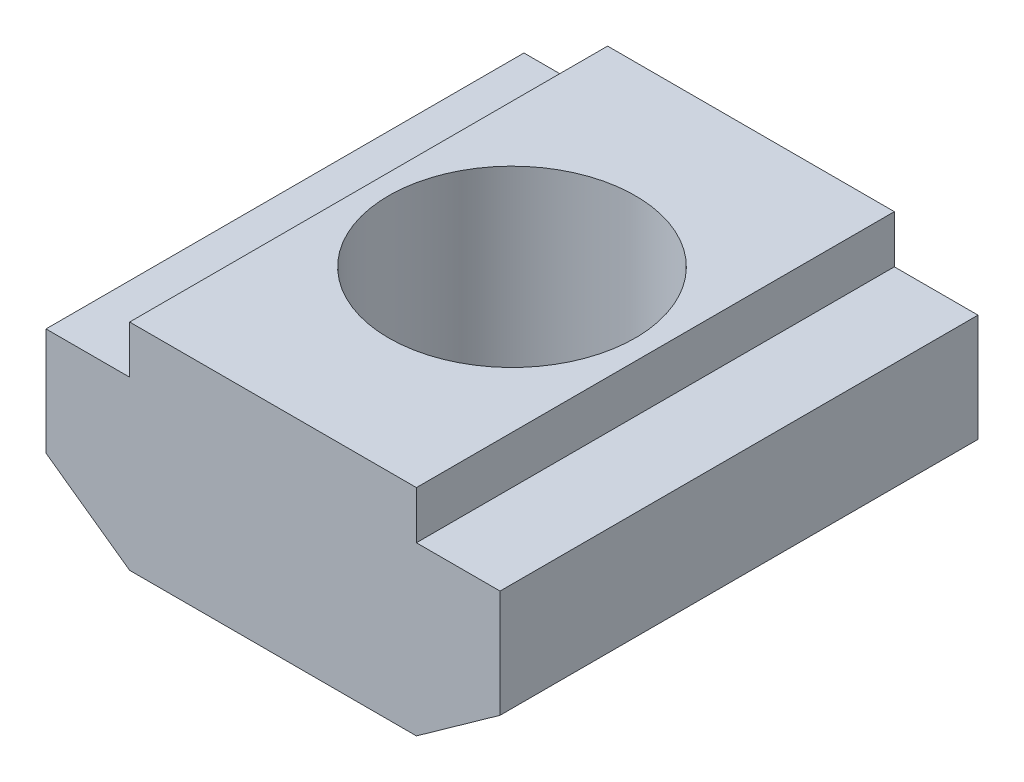
ISO-10303-21;
HEADER;
FILE_DESCRIPTION(('STEP AP214'),'2;1');
FILE_NAME('part.step','',(''),(''),'','','');
FILE_SCHEMA(('AUTOMOTIVE_DESIGN { 1 0 10303 214 1 1 1 1 }'));
ENDSEC;
DATA;
#1=APPLICATION_CONTEXT('core data for automotive mechanical design processes');
#2=APPLICATION_PROTOCOL_DEFINITION('international standard','automotive_design',2000,#1);
#3=PRODUCT_CONTEXT('',#1,'mechanical');
#4=PRODUCT('Part','Part','',(#3));
#5=PRODUCT_RELATED_PRODUCT_CATEGORY('part','',(#4));
#6=PRODUCT_DEFINITION_FORMATION('','',#4);
#7=PRODUCT_DEFINITION_CONTEXT('part definition',#1,'design');
#8=PRODUCT_DEFINITION('design','',#6,#7);
#9=PRODUCT_DEFINITION_SHAPE('','',#8);
#10=(LENGTH_UNIT() NAMED_UNIT(*) SI_UNIT(.MILLI.,.METRE.));
#11=(NAMED_UNIT(*) PLANE_ANGLE_UNIT() SI_UNIT($,.RADIAN.));
#12=(NAMED_UNIT(*) SI_UNIT($,.STERADIAN.) SOLID_ANGLE_UNIT());
#13=UNCERTAINTY_MEASURE_WITH_UNIT(LENGTH_MEASURE(1.E-05),#10,'distance_accuracy_value','');
#14=(GEOMETRIC_REPRESENTATION_CONTEXT(3) GLOBAL_UNCERTAINTY_ASSIGNED_CONTEXT((#13)) GLOBAL_UNIT_ASSIGNED_CONTEXT((#10,
#11,#12)) REPRESENTATION_CONTEXT('',''));
#15=CARTESIAN_POINT('',(0.,0.,0.));
#16=DIRECTION('',(0.,0.,1.));
#17=DIRECTION('',(1.,0.,0.));
#18=AXIS2_PLACEMENT_3D('',#15,#16,#17);
#19=CARTESIAN_POINT('',(2.99999999999989,1.11022302462516E-12,10.0000000000002));
#20=DIRECTION('',(-1.00000000000001,0.,0.));
#21=DIRECTION('',(0.,-0.999999999999998,0.));
#22=AXIS2_PLACEMENT_3D('',#19,#20,#21);
#23=PLANE('',#22);
#24=DIRECTION('',(0.,0.999999999999998,0.));
#25=VECTOR('',#24,1.);
#26=CARTESIAN_POINT('',(3.00000000000011,2.22044604925031E-13,6.66133814775094E-13));
#27=LINE('',#26,#25);
#28=CARTESIAN_POINT('',(3.00000000000011,-0.99999999999989,6.66133814775094E-13));
#29=VERTEX_POINT('',#28);
#30=CARTESIAN_POINT('',(3.00000000000011,2.22044604925031E-13,6.66133814775094E-13));
#31=VERTEX_POINT('',#30);
#32=EDGE_CURVE('E166',#29,#31,#27,.T.);
#33=ORIENTED_EDGE('',*,*,#32,.T.);
#34=DIRECTION('',(0.,0.,-0.999999999999998));
#35=VECTOR('',#34,1.);
#36=CARTESIAN_POINT('',(2.99999999999989,1.11022302462516E-12,10.0000000000002));
#37=LINE('',#36,#35);
#38=CARTESIAN_POINT('',(2.99999999999989,1.11022302462516E-12,10.0000000000002));
#39=VERTEX_POINT('',#38);
#40=EDGE_CURVE('E11',#39,#31,#37,.T.);
#41=ORIENTED_EDGE('',*,*,#40,.F.);
#42=DIRECTION('',(0.,0.999999999999998,0.));
#43=VECTOR('',#42,1.);
#44=CARTESIAN_POINT('',(2.99999999999989,1.11022302462516E-12,10.0000000000002));
#45=LINE('',#44,#43);
#46=CARTESIAN_POINT('',(3.00000000000034,-0.999999999999002,10.0000000000002));
#47=VERTEX_POINT('',#46);
#48=EDGE_CURVE('E195',#47,#39,#45,.T.);
#49=ORIENTED_EDGE('',*,*,#48,.F.);
#50=DIRECTION('',(0.,0.,-0.999999999999998));
#51=VECTOR('',#50,1.);
#52=CARTESIAN_POINT('',(3.00000000000034,-0.999999999999002,10.0000000000002));
#53=LINE('',#52,#51);
#54=EDGE_CURVE('E162',#47,#29,#53,.T.);
#55=ORIENTED_EDGE('',*,*,#54,.T.);
#56=EDGE_LOOP('',(#33,#41,#49,#55));
#57=FACE_BOUND('',#56,.T.);
#58=ADVANCED_FACE('F51',(#57),#23,.F.);
#59=CARTESIAN_POINT('',(-2.99999999999967,4.44089209850063E-13,9.99999999999956));
#60=DIRECTION('',(0.,-0.999999999999998,0.));
#61=DIRECTION('',(0.,0.,-0.999999999999998));
#62=AXIS2_PLACEMENT_3D('',#59,#60,#61);
#63=PLANE('',#62);
#64=CARTESIAN_POINT('',(0.,8.88178419700125E-13,5.00000000000012));
#65=DIRECTION('',(0.,0.999999999999998,0.));
#66=DIRECTION('',(0.,0.,0.999999999999998));
#67=AXIS2_PLACEMENT_3D('',#64,#65,#66);
#68=CIRCLE('',#67,2.58);
#69=CARTESIAN_POINT('',(1.11029371715187E-12,8.89045781438114E-13,7.58000000000011));
#70=VERTEX_POINT('',#69);
#71=EDGE_CURVE('E276',#70,#70,#68,.T.);
#72=ORIENTED_EDGE('',*,*,#71,.F.);
#73=EDGE_LOOP('',(#72));
#74=FACE_BOUND('',#73,.T.);
#75=DIRECTION('',(-1.00000000000001,0.,0.));
#76=VECTOR('',#75,1.);
#77=CARTESIAN_POINT('',(-3.00000000000011,-4.44089209850063E-13,-2.22044604925031E-13));
#78=LINE('',#77,#76);
#79=CARTESIAN_POINT('',(-3.00000000000011,-4.44089209850063E-13,-2.22044604925031E-13));
#80=VERTEX_POINT('',#79);
#81=EDGE_CURVE('E170',#31,#80,#78,.T.);
#82=ORIENTED_EDGE('',*,*,#81,.T.);
#83=DIRECTION('',(0.,0.,-0.999999999999998));
#84=VECTOR('',#83,1.);
#85=CARTESIAN_POINT('',(-2.99999999999967,4.44089209850063E-13,9.99999999999956));
#86=LINE('',#85,#84);
#87=CARTESIAN_POINT('',(-2.99999999999967,4.44089209850063E-13,9.99999999999956));
#88=VERTEX_POINT('',#87);
#89=EDGE_CURVE('E60',#88,#80,#86,.T.);
#90=ORIENTED_EDGE('',*,*,#89,.F.);
#91=DIRECTION('',(-1.00000000000001,0.,0.));
#92=VECTOR('',#91,1.);
#93=CARTESIAN_POINT('',(-2.99999999999967,4.44089209850063E-13,9.99999999999956));
#94=LINE('',#93,#92);
#95=EDGE_CURVE('E117',#39,#88,#94,.T.);
#96=ORIENTED_EDGE('',*,*,#95,.F.);
#97=ORIENTED_EDGE('',*,*,#40,.T.);
#98=EDGE_LOOP('',(#82,#90,#96,#97));
#99=FACE_BOUND('',#98,.T.);
#100=ADVANCED_FACE('F328',(#74,#99),#63,.F.);
#101=CARTESIAN_POINT('',(-2.99999999999967,4.44089209850063E-13,9.99999999999956));
#102=DIRECTION('',(1.00000000000001,0.,0.));
#103=DIRECTION('',(0.,0.999999999999998,0.));
#104=AXIS2_PLACEMENT_3D('',#101,#102,#103);
#105=PLANE('',#104);
#106=DIRECTION('',(0.,-0.999999999999998,0.));
#107=VECTOR('',#106,1.);
#108=CARTESIAN_POINT('',(-3.00000000000011,-4.44089209850063E-13,-2.22044604925031E-13));
#109=LINE('',#108,#107);
#110=CARTESIAN_POINT('',(-3.00000000000011,-1.00000000000033,-2.22044604925031E-13));
#111=VERTEX_POINT('',#110);
#112=EDGE_CURVE('E174',#80,#111,#109,.T.);
#113=ORIENTED_EDGE('',*,*,#112,.T.);
#114=DIRECTION('',(0.,0.,-0.999999999999998));
#115=VECTOR('',#114,1.);
#116=CARTESIAN_POINT('',(-2.99999999999967,-0.999999999999446,9.99999999999956));
#117=LINE('',#116,#115);
#118=CARTESIAN_POINT('',(-2.99999999999967,-0.999999999999446,9.99999999999956));
#119=VERTEX_POINT('',#118);
#120=EDGE_CURVE('E214',#119,#111,#117,.T.);
#121=ORIENTED_EDGE('',*,*,#120,.F.);
#122=DIRECTION('',(0.,-0.999999999999998,0.));
#123=VECTOR('',#122,1.);
#124=CARTESIAN_POINT('',(-2.99999999999967,4.44089209850063E-13,9.99999999999956));
#125=LINE('',#124,#123);
#126=EDGE_CURVE('E226',#88,#119,#125,.T.);
#127=ORIENTED_EDGE('',*,*,#126,.F.);
#128=ORIENTED_EDGE('',*,*,#89,.T.);
#129=EDGE_LOOP('',(#113,#121,#127,#128));
#130=FACE_BOUND('',#129,.T.);
#131=ADVANCED_FACE('F224',(#130),#105,.F.);
#132=CARTESIAN_POINT('',(-2.99999999999967,-0.999999999999446,9.99999999999956));
#133=DIRECTION('',(0.,-0.999999999999998,0.));
#134=DIRECTION('',(0.,0.,-0.999999999999998));
#135=AXIS2_PLACEMENT_3D('',#132,#133,#134);
#136=PLANE('',#135);
#137=DIRECTION('',(-1.00000000000001,0.,0.));
#138=VECTOR('',#137,1.);
#139=CARTESIAN_POINT('',(-3.00000000000011,-1.00000000000033,-2.22044604925031E-13));
#140=LINE('',#139,#138);
#141=CARTESIAN_POINT('',(-4.75000000000048,-1.00000000000033,0.));
#142=VERTEX_POINT('',#141);
#143=EDGE_CURVE('E177',#111,#142,#140,.T.);
#144=ORIENTED_EDGE('',*,*,#143,.T.);
#145=DIRECTION('',(0.,0.,-0.999999999999998));
#146=VECTOR('',#145,1.);
#147=CARTESIAN_POINT('',(-4.75000000000003,-0.999999999999446,10.));
#148=LINE('',#147,#146);
#149=CARTESIAN_POINT('',(-4.75000000000003,-0.999999999999446,10.));
#150=VERTEX_POINT('',#149);
#151=EDGE_CURVE('E210',#150,#142,#148,.T.);
#152=ORIENTED_EDGE('',*,*,#151,.F.);
#153=DIRECTION('',(-1.00000000000001,0.,0.));
#154=VECTOR('',#153,1.);
#155=CARTESIAN_POINT('',(-2.99999999999967,-0.999999999999446,9.99999999999956));
#156=LINE('',#155,#154);
#157=EDGE_CURVE('E245',#119,#150,#156,.T.);
#158=ORIENTED_EDGE('',*,*,#157,.F.);
#159=ORIENTED_EDGE('',*,*,#120,.T.);
#160=EDGE_LOOP('',(#144,#152,#158,#159));
#161=FACE_BOUND('',#160,.T.);
#162=ADVANCED_FACE('F235',(#161),#136,.F.);
#163=CARTESIAN_POINT('',(-4.75000000000003,-0.999999999999446,10.));
#164=DIRECTION('',(1.00000000000001,0.,0.));
#165=DIRECTION('',(0.,0.,-0.999999999999998));
#166=AXIS2_PLACEMENT_3D('',#163,#164,#165);
#167=PLANE('',#166);
#168=DIRECTION('',(0.,-0.999999999999998,0.));
#169=VECTOR('',#168,1.);
#170=CARTESIAN_POINT('',(-4.75000000000048,-1.00000000000033,0.));
#171=LINE('',#170,#169);
#172=CARTESIAN_POINT('',(-4.75000000000048,-3.25173713118065,0.));
#173=VERTEX_POINT('',#172);
#174=EDGE_CURVE('E180',#142,#173,#171,.T.);
#175=ORIENTED_EDGE('',*,*,#174,.T.);
#176=DIRECTION('',(0.,0.,-0.999999999999998));
#177=VECTOR('',#176,1.);
#178=CARTESIAN_POINT('',(-4.74999999999959,-3.25173713117977,10.));
#179=LINE('',#178,#177);
#180=CARTESIAN_POINT('',(-4.74999999999959,-3.25173713117977,10.));
#181=VERTEX_POINT('',#180);
#182=EDGE_CURVE('E206',#181,#173,#179,.T.);
#183=ORIENTED_EDGE('',*,*,#182,.F.);
#184=DIRECTION('',(0.,-0.999999999999998,0.));
#185=VECTOR('',#184,1.);
#186=CARTESIAN_POINT('',(-4.75000000000003,-0.999999999999446,10.));
#187=LINE('',#186,#185);
#188=EDGE_CURVE('E241',#150,#181,#187,.T.);
#189=ORIENTED_EDGE('',*,*,#188,.F.);
#190=ORIENTED_EDGE('',*,*,#151,.T.);
#191=EDGE_LOOP('',(#175,#183,#189,#190));
#192=FACE_BOUND('',#191,.T.);
#193=ADVANCED_FACE('F239',(#192),#167,.F.);
#194=CARTESIAN_POINT('',(-4.74999999999959,-3.25173713117977,10.));
#195=DIRECTION('',(0.580702955710946,0.814115518356316,0.));
#196=DIRECTION('',(-0.814115518356326,0.580702955710939,0.));
#197=AXIS2_PLACEMENT_3D('',#194,#195,#196);
#198=PLANE('',#197);
#199=DIRECTION('',(0.814115518356326,-0.580702955710939,0.));
#200=VECTOR('',#199,1.);
#201=CARTESIAN_POINT('',(-4.75000000000048,-3.25173713118065,0.));
#202=LINE('',#201,#200);
#203=CARTESIAN_POINT('',(-2.99999999999967,-4.50000000000039,-2.22044604925031E-13));
#204=VERTEX_POINT('',#203);
#205=EDGE_CURVE('E183',#173,#204,#202,.T.);
#206=ORIENTED_EDGE('',*,*,#205,.T.);
#207=DIRECTION('',(0.,0.,-0.999999999999998));
#208=VECTOR('',#207,1.);
#209=CARTESIAN_POINT('',(-3.00000000000078,-4.4999999999995,9.99999999999956));
#210=LINE('',#209,#208);
#211=CARTESIAN_POINT('',(-3.00000000000078,-4.4999999999995,9.99999999999956));
#212=VERTEX_POINT('',#211);
#213=EDGE_CURVE('E202',#212,#204,#210,.T.);
#214=ORIENTED_EDGE('',*,*,#213,.F.);
#215=DIRECTION('',(0.814115518356326,-0.580702955710939,0.));
#216=VECTOR('',#215,1.);
#217=CARTESIAN_POINT('',(-4.74999999999959,-3.25173713117977,10.));
#218=LINE('',#217,#216);
#219=EDGE_CURVE('E244',#181,#212,#218,.T.);
#220=ORIENTED_EDGE('',*,*,#219,.F.);
#221=ORIENTED_EDGE('',*,*,#182,.T.);
#222=EDGE_LOOP('',(#206,#214,#220,#221));
#223=FACE_BOUND('',#222,.T.);
#224=ADVANCED_FACE('F342',(#223),#198,.F.);
#225=CARTESIAN_POINT('',(3.00000000000034,-4.49999999999906,10.0000000000002));
#226=DIRECTION('',(0.,0.999999999999998,0.));
#227=DIRECTION('',(0.,0.,0.999999999999998));
#228=AXIS2_PLACEMENT_3D('',#225,#226,#227);
#229=PLANE('',#228);
#230=CARTESIAN_POINT('',(1.11022302462516E-12,-4.49999999999906,5.00000000000012));
#231=DIRECTION('',(0.,0.999999999999998,0.));
#232=DIRECTION('',(0.,0.,0.999999999999998));
#233=AXIS2_PLACEMENT_3D('',#230,#231,#232);
#234=CIRCLE('',#233,2.58);
#235=CARTESIAN_POINT('',(1.1102480879083E-12,-4.49999999999906,7.58000000000011));
#236=VERTEX_POINT('',#235);
#237=EDGE_CURVE('E171',#236,#236,#234,.F.);
#238=ORIENTED_EDGE('',*,*,#237,.F.);
#239=EDGE_LOOP('',(#238));
#240=FACE_BOUND('',#239,.T.);
#241=DIRECTION('',(1.00000000000001,0.,0.));
#242=VECTOR('',#241,1.);
#243=CARTESIAN_POINT('',(3.00000000000034,-4.49999999999995,6.66133814775094E-13));
#244=LINE('',#243,#242);
#245=CARTESIAN_POINT('',(3.00000000000034,-4.49999999999995,6.66133814775094E-13));
#246=VERTEX_POINT('',#245);
#247=EDGE_CURVE('E186',#204,#246,#244,.T.);
#248=ORIENTED_EDGE('',*,*,#247,.T.);
#249=DIRECTION('',(0.,0.,-0.999999999999998));
#250=VECTOR('',#249,1.);
#251=CARTESIAN_POINT('',(3.00000000000034,-4.49999999999906,10.0000000000002));
#252=LINE('',#251,#250);
#253=CARTESIAN_POINT('',(3.00000000000034,-4.49999999999906,10.0000000000002));
#254=VERTEX_POINT('',#253);
#255=EDGE_CURVE('E153',#254,#246,#252,.T.);
#256=ORIENTED_EDGE('',*,*,#255,.F.);
#257=DIRECTION('',(1.00000000000001,0.,0.));
#258=VECTOR('',#257,1.);
#259=CARTESIAN_POINT('',(3.00000000000034,-4.49999999999906,10.0000000000002));
#260=LINE('',#259,#258);
#261=EDGE_CURVE('E142',#212,#254,#260,.T.);
#262=ORIENTED_EDGE('',*,*,#261,.F.);
#263=ORIENTED_EDGE('',*,*,#213,.T.);
#264=EDGE_LOOP('',(#248,#256,#262,#263));
#265=FACE_BOUND('',#264,.T.);
#266=ADVANCED_FACE('F345',(#240,#265),#229,.F.);
#267=CARTESIAN_POINT('',(4.74999999999914,-3.2517371311791,10.0000000000009));
#268=DIRECTION('',(-0.580702955710947,0.814115518356316,0.));
#269=DIRECTION('',(-0.814115518356327,-0.580702955710939,0.));
#270=AXIS2_PLACEMENT_3D('',#267,#268,#269);
#271=PLANE('',#270);
#272=DIRECTION('',(0.814115518356327,0.580702955710939,0.));
#273=VECTOR('',#272,1.);
#274=CARTESIAN_POINT('',(4.74999999999914,-3.25173713117999,4.44089209850063E-13));
#275=LINE('',#274,#273);
#276=CARTESIAN_POINT('',(4.74999999999914,-3.25173713117999,4.44089209850063E-13));
#277=VERTEX_POINT('',#276);
#278=EDGE_CURVE('E151',#246,#277,#275,.T.);
#279=ORIENTED_EDGE('',*,*,#278,.T.);
#280=DIRECTION('',(0.,0.,-0.999999999999998));
#281=VECTOR('',#280,1.);
#282=CARTESIAN_POINT('',(4.74999999999914,-3.2517371311791,10.0000000000009));
#283=LINE('',#282,#281);
#284=CARTESIAN_POINT('',(4.74999999999914,-3.2517371311791,10.0000000000009));
#285=VERTEX_POINT('',#284);
#286=EDGE_CURVE('E148',#285,#277,#283,.T.);
#287=ORIENTED_EDGE('',*,*,#286,.F.);
#288=DIRECTION('',(0.814115518356327,0.580702955710939,0.));
#289=VECTOR('',#288,1.);
#290=CARTESIAN_POINT('',(4.74999999999914,-3.2517371311791,10.0000000000009));
#291=LINE('',#290,#289);
#292=EDGE_CURVE('E136',#254,#285,#291,.T.);
#293=ORIENTED_EDGE('',*,*,#292,.F.);
#294=ORIENTED_EDGE('',*,*,#255,.T.);
#295=EDGE_LOOP('',(#279,#287,#293,#294));
#296=FACE_BOUND('',#295,.T.);
#297=ADVANCED_FACE('F149',(#296),#271,.F.);
#298=CARTESIAN_POINT('',(4.74999999999914,-0.99999999999878,10.0000000000009));
#299=DIRECTION('',(-1.00000000000001,0.,0.));
#300=DIRECTION('',(0.,0.,0.999999999999998));
#301=AXIS2_PLACEMENT_3D('',#298,#299,#300);
#302=PLANE('',#301);
#303=DIRECTION('',(0.,0.999999999999998,0.));
#304=VECTOR('',#303,1.);
#305=CARTESIAN_POINT('',(4.75000000000025,-0.999999999999668,4.44089209850063E-13));
#306=LINE('',#305,#304);
#307=CARTESIAN_POINT('',(4.75000000000025,-0.999999999999668,4.44089209850063E-13));
#308=VERTEX_POINT('',#307);
#309=EDGE_CURVE('E103',#277,#308,#306,.T.);
#310=ORIENTED_EDGE('',*,*,#309,.T.);
#311=DIRECTION('',(0.,0.,-0.999999999999998));
#312=VECTOR('',#311,1.);
#313=CARTESIAN_POINT('',(4.74999999999914,-0.99999999999878,10.0000000000009));
#314=LINE('',#313,#312);
#315=CARTESIAN_POINT('',(4.74999999999914,-0.99999999999878,10.0000000000009));
#316=VERTEX_POINT('',#315);
#317=EDGE_CURVE('E154',#316,#308,#314,.T.);
#318=ORIENTED_EDGE('',*,*,#317,.F.);
#319=DIRECTION('',(0.,0.999999999999998,0.));
#320=VECTOR('',#319,1.);
#321=CARTESIAN_POINT('',(4.74999999999914,-0.99999999999878,10.0000000000009));
#322=LINE('',#321,#320);
#323=EDGE_CURVE('E140',#285,#316,#322,.T.);
#324=ORIENTED_EDGE('',*,*,#323,.F.);
#325=ORIENTED_EDGE('',*,*,#286,.T.);
#326=EDGE_LOOP('',(#310,#318,#324,#325));
#327=FACE_BOUND('',#326,.T.);
#328=ADVANCED_FACE('F156',(#327),#302,.F.);
#329=CARTESIAN_POINT('',(3.00000000000034,-0.999999999999002,10.0000000000002));
#330=DIRECTION('',(0.,-0.999999999999998,0.));
#331=DIRECTION('',(0.,0.,-0.999999999999998));
#332=AXIS2_PLACEMENT_3D('',#329,#330,#331);
#333=PLANE('',#332);
#334=DIRECTION('',(-1.00000000000001,0.,0.));
#335=VECTOR('',#334,1.);
#336=CARTESIAN_POINT('',(3.00000000000011,-0.99999999999989,6.66133814775094E-13));
#337=LINE('',#336,#335);
#338=EDGE_CURVE('E109',#308,#29,#337,.T.);
#339=ORIENTED_EDGE('',*,*,#338,.T.);
#340=ORIENTED_EDGE('',*,*,#54,.F.);
#341=DIRECTION('',(-1.00000000000001,0.,0.));
#342=VECTOR('',#341,1.);
#343=CARTESIAN_POINT('',(3.00000000000034,-0.999999999999002,10.0000000000002));
#344=LINE('',#343,#342);
#345=EDGE_CURVE('E68',#316,#47,#344,.T.);
#346=ORIENTED_EDGE('',*,*,#345,.F.);
#347=ORIENTED_EDGE('',*,*,#317,.T.);
#348=EDGE_LOOP('',(#339,#340,#346,#347));
#349=FACE_BOUND('',#348,.T.);
#350=ADVANCED_FACE('F354',(#349),#333,.F.);
#351=CARTESIAN_POINT('',(0.,8.88178419700125E-13,9.99999999999956));
#352=DIRECTION('',(0.,0.,0.999999999999998));
#353=DIRECTION('',(1.00000000000001,0.,0.));
#354=AXIS2_PLACEMENT_3D('',#351,#352,#353);
#355=PLANE('',#354);
#356=ORIENTED_EDGE('',*,*,#48,.T.);
#357=ORIENTED_EDGE('',*,*,#95,.T.);
#358=ORIENTED_EDGE('',*,*,#126,.T.);
#359=ORIENTED_EDGE('',*,*,#157,.T.);
#360=ORIENTED_EDGE('',*,*,#188,.T.);
#361=ORIENTED_EDGE('',*,*,#219,.T.);
#362=ORIENTED_EDGE('',*,*,#261,.T.);
#363=ORIENTED_EDGE('',*,*,#292,.T.);
#364=ORIENTED_EDGE('',*,*,#323,.T.);
#365=ORIENTED_EDGE('',*,*,#345,.T.);
#366=EDGE_LOOP('',(#356,#357,#358,#359,#360,#361,#362,#363,#364,#365));
#367=FACE_BOUND('',#366,.T.);
#368=ADVANCED_FACE('F138',(#367),#355,.T.);
#369=CARTESIAN_POINT('',(0.,0.,0.));
#370=DIRECTION('',(0.,0.,0.999999999999998));
#371=DIRECTION('',(1.00000000000001,0.,0.));
#372=AXIS2_PLACEMENT_3D('',#369,#370,#371);
#373=PLANE('',#372);
#374=ORIENTED_EDGE('',*,*,#32,.F.);
#375=ORIENTED_EDGE('',*,*,#338,.F.);
#376=ORIENTED_EDGE('',*,*,#309,.F.);
#377=ORIENTED_EDGE('',*,*,#278,.F.);
#378=ORIENTED_EDGE('',*,*,#247,.F.);
#379=ORIENTED_EDGE('',*,*,#205,.F.);
#380=ORIENTED_EDGE('',*,*,#174,.F.);
#381=ORIENTED_EDGE('',*,*,#143,.F.);
#382=ORIENTED_EDGE('',*,*,#112,.F.);
#383=ORIENTED_EDGE('',*,*,#81,.F.);
#384=EDGE_LOOP('',(#374,#375,#376,#377,#378,#379,#380,#381,#382,#383));
#385=FACE_BOUND('',#384,.T.);
#386=ADVANCED_FACE('F230',(#385),#373,.F.);
#387=CARTESIAN_POINT('',(1.11022302462516E-12,-4.50099999999898,5.00000000000012));
#388=DIRECTION('',(0.,0.999999999999998,0.));
#389=DIRECTION('',(0.,0.,0.999999999999998));
#390=AXIS2_PLACEMENT_3D('',#387,#388,#389);
#391=CYLINDRICAL_SURFACE('',#390,2.58);
#392=CARTESIAN_POINT('',(1.11029371715187E-12,8.89045781438114E-13,7.58000000000011));
#393=CARTESIAN_POINT('',(1.11029324184725E-12,-0.0468749999991101,7.58000000000011));
#394=CARTESIAN_POINT('',(1.11029276654263E-12,-0.0937499999991093,7.58000000000011));
#395=CARTESIAN_POINT('',(1.11029181593339E-12,-0.187499999999108,7.58000000000011));
#396=CARTESIAN_POINT('',(1.11029134062877E-12,-0.234374999999108,7.58000000000011));
#397=CARTESIAN_POINT('',(1.11029039001953E-12,-0.328124999999107,7.58000000000011));
#398=CARTESIAN_POINT('',(1.11028991471491E-12,-0.374999999999106,7.58000000000011));
#399=CARTESIAN_POINT('',(1.11028896410567E-12,-0.468749999999105,7.58000000000011));
#400=CARTESIAN_POINT('',(1.11028848880105E-12,-0.515624999999105,7.58000000000011));
#401=CARTESIAN_POINT('',(1.1102875381918E-12,-0.609374999999104,7.58000000000011));
#402=CARTESIAN_POINT('',(1.11028706288718E-12,-0.656249999999103,7.58000000000011));
#403=CARTESIAN_POINT('',(1.11028611227794E-12,-0.749999999999102,7.58000000000011));
#404=CARTESIAN_POINT('',(1.11028563697332E-12,-0.796874999999102,7.58000000000011));
#405=CARTESIAN_POINT('',(1.11028468636408E-12,-0.890624999999101,7.58000000000011));
#406=CARTESIAN_POINT('',(1.11028421105946E-12,-0.9374999999991,7.58000000000011));
#407=CARTESIAN_POINT('',(1.11028326045022E-12,-1.0312499999991,7.58000000000011));
#408=CARTESIAN_POINT('',(1.1102827851456E-12,-1.0781249999991,7.58000000000011));
#409=CARTESIAN_POINT('',(1.11028183453636E-12,-1.1718749999991,7.58000000000011));
#410=CARTESIAN_POINT('',(1.11028135923174E-12,-1.2187499999991,7.58000000000011));
#411=CARTESIAN_POINT('',(1.1102804086225E-12,-1.3124999999991,7.58000000000011));
#412=CARTESIAN_POINT('',(1.11027993331788E-12,-1.35937499999909,7.58000000000011));
#413=CARTESIAN_POINT('',(1.11027898270863E-12,-1.45312499999909,7.58000000000011));
#414=CARTESIAN_POINT('',(1.11027850740401E-12,-1.49999999999909,7.58000000000011));
#415=CARTESIAN_POINT('',(1.11027755679477E-12,-1.59374999999909,7.58000000000011));
#416=CARTESIAN_POINT('',(1.11027708149015E-12,-1.64062499999909,7.58000000000011));
#417=CARTESIAN_POINT('',(1.11027613088091E-12,-1.73437499999909,7.58000000000011));
#418=CARTESIAN_POINT('',(1.11027565557629E-12,-1.78124999999909,7.58000000000011));
#419=CARTESIAN_POINT('',(1.11027470496705E-12,-1.87499999999909,7.58000000000011));
#420=CARTESIAN_POINT('',(1.11027422966243E-12,-1.92187499999909,7.58000000000011));
#421=CARTESIAN_POINT('',(1.11027327905319E-12,-2.01562499999909,7.58000000000011));
#422=CARTESIAN_POINT('',(1.11027280374857E-12,-2.06249999999909,7.58000000000011));
#423=CARTESIAN_POINT('',(1.11027185313933E-12,-2.15624999999909,7.58000000000011));
#424=CARTESIAN_POINT('',(1.11027137783471E-12,-2.20312499999909,7.58000000000011));
#425=CARTESIAN_POINT('',(1.11027042722547E-12,-2.29687499999908,7.58000000000011));
#426=CARTESIAN_POINT('',(1.11026995192084E-12,-2.34374999999908,7.58000000000011));
#427=CARTESIAN_POINT('',(1.1102690013116E-12,-2.43749999999908,7.58000000000011));
#428=CARTESIAN_POINT('',(1.11026852600698E-12,-2.48437499999908,7.58000000000011));
#429=CARTESIAN_POINT('',(1.11026757539774E-12,-2.57812499999908,7.58000000000011));
#430=CARTESIAN_POINT('',(1.11026710009312E-12,-2.62499999999908,7.58000000000011));
#431=CARTESIAN_POINT('',(1.11026614948388E-12,-2.71874999999908,7.58000000000011));
#432=CARTESIAN_POINT('',(1.11026567417926E-12,-2.76562499999908,7.58000000000011));
#433=CARTESIAN_POINT('',(1.11026472357002E-12,-2.85937499999908,7.58000000000011));
#434=CARTESIAN_POINT('',(1.1102642482654E-12,-2.90624999999908,7.58000000000011));
#435=CARTESIAN_POINT('',(1.11026329765616E-12,-2.99999999999908,7.58000000000011));
#436=CARTESIAN_POINT('',(1.11026282235154E-12,-3.04687499999908,7.58000000000011));
#437=CARTESIAN_POINT('',(1.1102618717423E-12,-3.14062499999907,7.58000000000011));
#438=CARTESIAN_POINT('',(1.11026139643768E-12,-3.18749999999907,7.58000000000011));
#439=CARTESIAN_POINT('',(1.11026044582843E-12,-3.28124999999907,7.58000000000011));
#440=CARTESIAN_POINT('',(1.11025997052381E-12,-3.32812499999907,7.58000000000011));
#441=CARTESIAN_POINT('',(1.11025901991457E-12,-3.42187499999907,7.58000000000011));
#442=CARTESIAN_POINT('',(1.11025854460995E-12,-3.46874999999907,7.58000000000011));
#443=CARTESIAN_POINT('',(1.11025759400071E-12,-3.56249999999907,7.58000000000011));
#444=CARTESIAN_POINT('',(1.11025711869609E-12,-3.60937499999907,7.58000000000011));
#445=CARTESIAN_POINT('',(1.11025616808685E-12,-3.70312499999907,7.58000000000011));
#446=CARTESIAN_POINT('',(1.11025569278223E-12,-3.74999999999907,7.58000000000011));
#447=CARTESIAN_POINT('',(1.11025474217299E-12,-3.84374999999907,7.58000000000011));
#448=CARTESIAN_POINT('',(1.11025426686837E-12,-3.89062499999907,7.58000000000011));
#449=CARTESIAN_POINT('',(1.11025331625913E-12,-3.98437499999907,7.58000000000011));
#450=CARTESIAN_POINT('',(1.11025284095451E-12,-4.03124999999906,7.58000000000011));
#451=CARTESIAN_POINT('',(1.11025189034527E-12,-4.12499999999906,7.58000000000011));
#452=CARTESIAN_POINT('',(1.11025141504064E-12,-4.17187499999906,7.58000000000011));
#453=CARTESIAN_POINT('',(1.1102504644314E-12,-4.26562499999906,7.58000000000011));
#454=CARTESIAN_POINT('',(1.11024998912678E-12,-4.31249999999906,7.58000000000011));
#455=CARTESIAN_POINT('',(1.11024903851754E-12,-4.40624999999906,7.58000000000011));
#456=CARTESIAN_POINT('',(1.11024856321292E-12,-4.45312499999906,7.58000000000011));
#457=CARTESIAN_POINT('',(1.1102480879083E-12,-4.49999999999906,7.58000000000011));
#458=B_SPLINE_CURVE_WITH_KNOTS('',3,(#392,#393,#394,#395,#396,#397,#398,#399,#400,#401,#402,
#403,#404,#405,#406,#407,#408,#409,#410,#411,#412,#413,#414,#415,#416,#417,#418,#419,#420,#421,
#422,#423,#424,#425,#426,#427,#428,#429,#430,#431,#432,#433,#434,#435,#436,#437,#438,#439,#440,
#441,#442,#443,#444,#445,#446,#447,#448,#449,#450,#451,#452,#453,#454,#455,#456,#457),
.UNSPECIFIED.,.F.,.F.,(4,2,2,2,2,2,2,2,2,2,2,2,2,2,2,2,2,2,2,2,2,2,2,2,2,2,2,2,2,2,2,2,4),(0.,
0.140624999999998,0.281249999999997,0.421874999999994,0.562499999999994,0.703124999999992,
0.84374999999999,0.984374999999989,1.12499999999999,1.26562499999999,1.40624999999998,
1.54687499999998,1.68749999999998,1.82812499999998,1.96874999999998,2.10937499999998,
2.24999999999997,2.39062499999997,2.53124999999997,2.67187499999997,2.81249999999997,
2.95312499999997,3.09374999999996,3.23437499999996,3.37499999999996,3.51562499999996,
3.65624999999996,3.79687499999996,3.93749999999995,4.07812499999995,4.21874999999995,
4.35937499999995,4.49999999999995),.UNSPECIFIED.);
#459=EDGE_CURVE('BSEAM359',#70,#236,#458,.T.);
#460=ORIENTED_EDGE('',*,*,#71,.T.);
#461=ORIENTED_EDGE('',*,*,#237,.T.);
#462=ORIENTED_EDGE('',*,*,#459,.T.);
#463=ORIENTED_EDGE('',*,*,#459,.F.);
#464=EDGE_LOOP('',(#460,#462,#461,#463));
#465=FACE_BOUND('',#464,.T.);
#466=ADVANCED_FACE('F359',(#465),#391,.F.);
#467=CLOSED_SHELL('',(#58,#100,#131,#162,#193,#224,#266,#297,#328,#350,#368,#386,#466));
#468=MANIFOLD_SOLID_BREP('B2',#467);
#469=ADVANCED_BREP_SHAPE_REPRESENTATION('',(#18,#468),#14);
#470=SHAPE_DEFINITION_REPRESENTATION(#9,#469);
ENDSEC;
END-ISO-10303-21;
